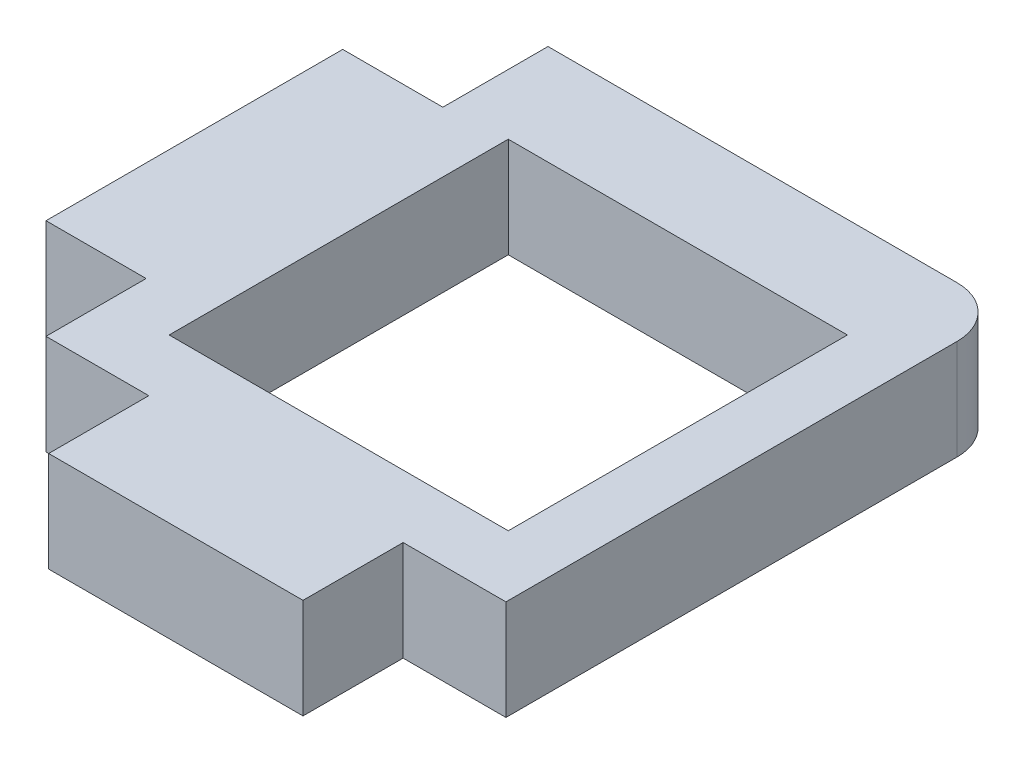
ISO-10303-21;
HEADER;
FILE_DESCRIPTION(('STEP AP214'),'2;1');
FILE_NAME('part.step','',(''),(''),'','','');
FILE_SCHEMA(('AUTOMOTIVE_DESIGN { 1 0 10303 214 1 1 1 1 }'));
ENDSEC;
DATA;
#1=APPLICATION_CONTEXT('core data for automotive mechanical design processes');
#2=APPLICATION_PROTOCOL_DEFINITION('international standard','automotive_design',2000,#1);
#3=PRODUCT_CONTEXT('',#1,'mechanical');
#4=PRODUCT('Part','Part','',(#3));
#5=PRODUCT_RELATED_PRODUCT_CATEGORY('part','',(#4));
#6=PRODUCT_DEFINITION_FORMATION('','',#4);
#7=PRODUCT_DEFINITION_CONTEXT('part definition',#1,'design');
#8=PRODUCT_DEFINITION('design','',#6,#7);
#9=PRODUCT_DEFINITION_SHAPE('','',#8);
#10=(LENGTH_UNIT() NAMED_UNIT(*) SI_UNIT(.MILLI.,.METRE.));
#11=(NAMED_UNIT(*) PLANE_ANGLE_UNIT() SI_UNIT($,.RADIAN.));
#12=(NAMED_UNIT(*) SI_UNIT($,.STERADIAN.) SOLID_ANGLE_UNIT());
#13=UNCERTAINTY_MEASURE_WITH_UNIT(LENGTH_MEASURE(1.E-05),#10,'distance_accuracy_value','');
#14=(GEOMETRIC_REPRESENTATION_CONTEXT(3) GLOBAL_UNCERTAINTY_ASSIGNED_CONTEXT((#13)) GLOBAL_UNIT_ASSIGNED_CONTEXT((#10,
#11,#12)) REPRESENTATION_CONTEXT('',''));
#15=CARTESIAN_POINT('',(0.,0.,0.));
#16=DIRECTION('',(0.,0.,1.));
#17=DIRECTION('',(1.,0.,0.));
#18=AXIS2_PLACEMENT_3D('',#15,#16,#17);
#19=CARTESIAN_POINT('',(6.88974999999999,-3.,0.));
#20=DIRECTION('',(1.,0.,0.));
#21=DIRECTION('',(0.,0.,-1.));
#22=AXIS2_PLACEMENT_3D('',#19,#20,#21);
#23=PLANE('',#22);
#24=DIRECTION('',(0.,0.,-1.));
#25=VECTOR('',#24,1.);
#26=CARTESIAN_POINT('',(6.88974999999999,0.,0.));
#27=LINE('',#26,#25);
#28=CARTESIAN_POINT('',(6.88975,0.,6.0198));
#29=VERTEX_POINT('',#28);
#30=CARTESIAN_POINT('',(6.88975,0.,-7.49579999999999));
#31=VERTEX_POINT('',#30);
#32=EDGE_CURVE('E218',#29,#31,#27,.T.);
#33=ORIENTED_EDGE('',*,*,#32,.F.);
#34=DIRECTION('',(0.,1.,0.));
#35=VECTOR('',#34,1.);
#36=CARTESIAN_POINT('',(6.88975,-3.,6.0198));
#37=LINE('',#36,#35);
#38=CARTESIAN_POINT('',(6.88975,-3.,6.0198));
#39=VERTEX_POINT('',#38);
#40=EDGE_CURVE('E11',#39,#29,#37,.T.);
#41=ORIENTED_EDGE('',*,*,#40,.F.);
#42=DIRECTION('',(0.,0.,-1.));
#43=VECTOR('',#42,1.);
#44=CARTESIAN_POINT('',(6.88974999999999,-3.,0.));
#45=LINE('',#44,#43);
#46=CARTESIAN_POINT('',(6.88975,-3.,-7.49579999999999));
#47=VERTEX_POINT('',#46);
#48=EDGE_CURVE('E328',#39,#47,#45,.T.);
#49=ORIENTED_EDGE('',*,*,#48,.T.);
#50=DIRECTION('',(0.,1.,0.));
#51=VECTOR('',#50,1.);
#52=CARTESIAN_POINT('',(6.88975,-3.,-7.49579999999999));
#53=LINE('',#52,#51);
#54=EDGE_CURVE('E298',#47,#31,#53,.T.);
#55=ORIENTED_EDGE('',*,*,#54,.T.);
#56=EDGE_LOOP('',(#33,#41,#49,#55));
#57=FACE_BOUND('',#56,.T.);
#58=ADVANCED_FACE('F45',(#57),#23,.T.);
#59=CARTESIAN_POINT('',(0.,-3.,6.01980000000001));
#60=DIRECTION('',(0.,0.,1.));
#61=DIRECTION('',(1.,0.,0.));
#62=AXIS2_PLACEMENT_3D('',#59,#60,#61);
#63=PLANE('',#62);
#64=DIRECTION('',(1.,0.,0.));
#65=VECTOR('',#64,1.);
#66=CARTESIAN_POINT('',(0.,0.,6.01980000000001));
#67=LINE('',#66,#65);
#68=CARTESIAN_POINT('',(3.81,0.,6.0198));
#69=VERTEX_POINT('',#68);
#70=EDGE_CURVE('E263',#69,#29,#67,.T.);
#71=ORIENTED_EDGE('',*,*,#70,.F.);
#72=DIRECTION('',(0.,1.,0.));
#73=VECTOR('',#72,1.);
#74=CARTESIAN_POINT('',(3.81,-3.,6.0198));
#75=LINE('',#74,#73);
#76=CARTESIAN_POINT('',(3.81,-3.,6.0198));
#77=VERTEX_POINT('',#76);
#78=EDGE_CURVE('E56',#77,#69,#75,.T.);
#79=ORIENTED_EDGE('',*,*,#78,.F.);
#80=DIRECTION('',(1.,0.,0.));
#81=VECTOR('',#80,1.);
#82=CARTESIAN_POINT('',(0.,-3.,6.01980000000001));
#83=LINE('',#82,#81);
#84=EDGE_CURVE('E188',#77,#39,#83,.T.);
#85=ORIENTED_EDGE('',*,*,#84,.T.);
#86=ORIENTED_EDGE('',*,*,#40,.T.);
#87=EDGE_LOOP('',(#71,#79,#85,#86));
#88=FACE_BOUND('',#87,.T.);
#89=ADVANCED_FACE('F396',(#88),#63,.T.);
#90=CARTESIAN_POINT('',(3.81,-3.,0.));
#91=DIRECTION('',(1.,0.,0.));
#92=DIRECTION('',(0.,0.,-1.));
#93=AXIS2_PLACEMENT_3D('',#90,#91,#92);
#94=PLANE('',#93);
#95=DIRECTION('',(0.,0.,-1.));
#96=VECTOR('',#95,1.);
#97=CARTESIAN_POINT('',(3.81,0.,0.));
#98=LINE('',#97,#96);
#99=CARTESIAN_POINT('',(3.81,0.,9.0198));
#100=VERTEX_POINT('',#99);
#101=EDGE_CURVE('E176',#100,#69,#98,.T.);
#102=ORIENTED_EDGE('',*,*,#101,.F.);
#103=DIRECTION('',(0.,1.,0.));
#104=VECTOR('',#103,1.);
#105=CARTESIAN_POINT('',(3.81,-3.,9.0198));
#106=LINE('',#105,#104);
#107=CARTESIAN_POINT('',(3.81,-3.,9.0198));
#108=VERTEX_POINT('',#107);
#109=EDGE_CURVE('E171',#108,#100,#106,.T.);
#110=ORIENTED_EDGE('',*,*,#109,.F.);
#111=DIRECTION('',(0.,0.,-1.));
#112=VECTOR('',#111,1.);
#113=CARTESIAN_POINT('',(3.81,-3.,0.));
#114=LINE('',#113,#112);
#115=EDGE_CURVE('E174',#108,#77,#114,.T.);
#116=ORIENTED_EDGE('',*,*,#115,.T.);
#117=ORIENTED_EDGE('',*,*,#78,.T.);
#118=EDGE_LOOP('',(#102,#110,#116,#117));
#119=FACE_BOUND('',#118,.T.);
#120=ADVANCED_FACE('F173',(#119),#94,.T.);
#121=CARTESIAN_POINT('',(0.,-3.,9.0198));
#122=DIRECTION('',(0.,0.,1.));
#123=DIRECTION('',(1.,0.,0.));
#124=AXIS2_PLACEMENT_3D('',#121,#122,#123);
#125=PLANE('',#124);
#126=DIRECTION('',(1.,0.,0.));
#127=VECTOR('',#126,1.);
#128=CARTESIAN_POINT('',(0.,0.,9.0198));
#129=LINE('',#128,#127);
#130=CARTESIAN_POINT('',(-3.81,0.,9.0198));
#131=VERTEX_POINT('',#130);
#132=EDGE_CURVE('E258',#131,#100,#129,.T.);
#133=ORIENTED_EDGE('',*,*,#132,.F.);
#134=DIRECTION('',(0.,1.,0.));
#135=VECTOR('',#134,1.);
#136=CARTESIAN_POINT('',(-3.81,-3.,9.0198));
#137=LINE('',#136,#135);
#138=CARTESIAN_POINT('',(-3.81,-3.,9.0198));
#139=VERTEX_POINT('',#138);
#140=EDGE_CURVE('E182',#139,#131,#137,.T.);
#141=ORIENTED_EDGE('',*,*,#140,.F.);
#142=DIRECTION('',(1.,0.,0.));
#143=VECTOR('',#142,1.);
#144=CARTESIAN_POINT('',(0.,-3.,9.0198));
#145=LINE('',#144,#143);
#146=EDGE_CURVE('E187',#139,#108,#145,.T.);
#147=ORIENTED_EDGE('',*,*,#146,.T.);
#148=ORIENTED_EDGE('',*,*,#109,.T.);
#149=EDGE_LOOP('',(#133,#141,#147,#148));
#150=FACE_BOUND('',#149,.T.);
#151=ADVANCED_FACE('F191',(#150),#125,.T.);
#152=CARTESIAN_POINT('',(-3.81,-3.,0.));
#153=DIRECTION('',(1.,0.,0.));
#154=DIRECTION('',(0.,0.,-1.));
#155=AXIS2_PLACEMENT_3D('',#152,#153,#154);
#156=PLANE('',#155);
#157=DIRECTION('',(0.,0.,-1.));
#158=VECTOR('',#157,1.);
#159=CARTESIAN_POINT('',(-3.81,0.,0.));
#160=LINE('',#159,#158);
#161=CARTESIAN_POINT('',(-3.81,0.,6.0198));
#162=VERTEX_POINT('',#161);
#163=EDGE_CURVE('E254',#131,#162,#160,.T.);
#164=ORIENTED_EDGE('',*,*,#163,.T.);
#165=DIRECTION('',(0.,1.,0.));
#166=VECTOR('',#165,1.);
#167=CARTESIAN_POINT('',(-3.81,-3.,6.0198));
#168=LINE('',#167,#166);
#169=CARTESIAN_POINT('',(-3.81,-3.,6.0198));
#170=VERTEX_POINT('',#169);
#171=EDGE_CURVE('E272',#170,#162,#168,.T.);
#172=ORIENTED_EDGE('',*,*,#171,.F.);
#173=DIRECTION('',(0.,0.,-1.));
#174=VECTOR('',#173,1.);
#175=CARTESIAN_POINT('',(-3.81,-3.,0.));
#176=LINE('',#175,#174);
#177=EDGE_CURVE('E194',#139,#170,#176,.T.);
#178=ORIENTED_EDGE('',*,*,#177,.F.);
#179=ORIENTED_EDGE('',*,*,#140,.T.);
#180=EDGE_LOOP('',(#164,#172,#178,#179));
#181=FACE_BOUND('',#180,.T.);
#182=ADVANCED_FACE('F399',(#181),#156,.F.);
#183=CARTESIAN_POINT('',(0.,-3.,6.01980000000001));
#184=DIRECTION('',(0.,0.,1.));
#185=DIRECTION('',(1.,0.,0.));
#186=AXIS2_PLACEMENT_3D('',#183,#184,#185);
#187=PLANE('',#186);
#188=DIRECTION('',(1.,0.,0.));
#189=VECTOR('',#188,1.);
#190=CARTESIAN_POINT('',(0.,0.,6.01980000000001));
#191=LINE('',#190,#189);
#192=CARTESIAN_POINT('',(-6.88975,0.,6.0198));
#193=VERTEX_POINT('',#192);
#194=EDGE_CURVE('E250',#193,#162,#191,.T.);
#195=ORIENTED_EDGE('',*,*,#194,.F.);
#196=DIRECTION('',(0.,1.,0.));
#197=VECTOR('',#196,1.);
#198=CARTESIAN_POINT('',(-6.88975,-3.,6.0198));
#199=LINE('',#198,#197);
#200=CARTESIAN_POINT('',(-6.88975,-3.,6.0198));
#201=VERTEX_POINT('',#200);
#202=EDGE_CURVE('E275',#201,#193,#199,.T.);
#203=ORIENTED_EDGE('',*,*,#202,.F.);
#204=DIRECTION('',(1.,0.,0.));
#205=VECTOR('',#204,1.);
#206=CARTESIAN_POINT('',(0.,-3.,6.01980000000001));
#207=LINE('',#206,#205);
#208=EDGE_CURVE('E197',#201,#170,#207,.T.);
#209=ORIENTED_EDGE('',*,*,#208,.T.);
#210=ORIENTED_EDGE('',*,*,#171,.T.);
#211=EDGE_LOOP('',(#195,#203,#209,#210));
#212=FACE_BOUND('',#211,.T.);
#213=ADVANCED_FACE('F368',(#212),#187,.T.);
#214=CARTESIAN_POINT('',(-6.88975,-3.,0.));
#215=DIRECTION('',(-1.,0.,0.));
#216=DIRECTION('',(0.,0.,1.));
#217=AXIS2_PLACEMENT_3D('',#214,#215,#216);
#218=PLANE('',#217);
#219=DIRECTION('',(0.,0.,1.));
#220=VECTOR('',#219,1.);
#221=CARTESIAN_POINT('',(-6.88975,0.,0.));
#222=LINE('',#221,#220);
#223=CARTESIAN_POINT('',(-6.88975,0.,3.0198));
#224=VERTEX_POINT('',#223);
#225=EDGE_CURVE('E246',#224,#193,#222,.T.);
#226=ORIENTED_EDGE('',*,*,#225,.F.);
#227=DIRECTION('',(0.,1.,0.));
#228=VECTOR('',#227,1.);
#229=CARTESIAN_POINT('',(-6.88975,-3.,3.0198));
#230=LINE('',#229,#228);
#231=CARTESIAN_POINT('',(-6.88975,-3.,3.0198));
#232=VERTEX_POINT('',#231);
#233=EDGE_CURVE('E278',#232,#224,#230,.T.);
#234=ORIENTED_EDGE('',*,*,#233,.F.);
#235=DIRECTION('',(0.,0.,1.));
#236=VECTOR('',#235,1.);
#237=CARTESIAN_POINT('',(-6.88975,-3.,0.));
#238=LINE('',#237,#236);
#239=EDGE_CURVE('E360',#232,#201,#238,.T.);
#240=ORIENTED_EDGE('',*,*,#239,.T.);
#241=ORIENTED_EDGE('',*,*,#202,.T.);
#242=EDGE_LOOP('',(#226,#234,#240,#241));
#243=FACE_BOUND('',#242,.T.);
#244=ADVANCED_FACE('F374',(#243),#218,.T.);
#245=CARTESIAN_POINT('',(0.,-3.,3.0198));
#246=DIRECTION('',(0.,0.,1.));
#247=DIRECTION('',(1.,0.,0.));
#248=AXIS2_PLACEMENT_3D('',#245,#246,#247);
#249=PLANE('',#248);
#250=DIRECTION('',(1.,0.,0.));
#251=VECTOR('',#250,1.);
#252=CARTESIAN_POINT('',(0.,0.,3.0198));
#253=LINE('',#252,#251);
#254=CARTESIAN_POINT('',(-9.88975,0.,3.0198));
#255=VERTEX_POINT('',#254);
#256=EDGE_CURVE('E242',#255,#224,#253,.T.);
#257=ORIENTED_EDGE('',*,*,#256,.F.);
#258=DIRECTION('',(0.,1.,0.));
#259=VECTOR('',#258,1.);
#260=CARTESIAN_POINT('',(-9.88975,-3.,3.0198));
#261=LINE('',#260,#259);
#262=CARTESIAN_POINT('',(-9.88975,-3.,3.0198));
#263=VERTEX_POINT('',#262);
#264=EDGE_CURVE('E281',#263,#255,#261,.T.);
#265=ORIENTED_EDGE('',*,*,#264,.F.);
#266=DIRECTION('',(1.,0.,0.));
#267=VECTOR('',#266,1.);
#268=CARTESIAN_POINT('',(0.,-3.,3.0198));
#269=LINE('',#268,#267);
#270=EDGE_CURVE('E356',#263,#232,#269,.T.);
#271=ORIENTED_EDGE('',*,*,#270,.T.);
#272=ORIENTED_EDGE('',*,*,#233,.T.);
#273=EDGE_LOOP('',(#257,#265,#271,#272));
#274=FACE_BOUND('',#273,.T.);
#275=ADVANCED_FACE('F377',(#274),#249,.T.);
#276=CARTESIAN_POINT('',(-9.88975,-3.,0.));
#277=DIRECTION('',(1.,0.,0.));
#278=DIRECTION('',(0.,0.,-1.));
#279=AXIS2_PLACEMENT_3D('',#276,#277,#278);
#280=PLANE('',#279);
#281=DIRECTION('',(0.,0.,-1.));
#282=VECTOR('',#281,1.);
#283=CARTESIAN_POINT('',(-9.88975,0.,0.));
#284=LINE('',#283,#282);
#285=CARTESIAN_POINT('',(-9.88975,0.,-5.8702));
#286=VERTEX_POINT('',#285);
#287=EDGE_CURVE('E238',#255,#286,#284,.T.);
#288=ORIENTED_EDGE('',*,*,#287,.T.);
#289=DIRECTION('',(0.,1.,0.));
#290=VECTOR('',#289,1.);
#291=CARTESIAN_POINT('',(-9.88975,-3.,-5.8702));
#292=LINE('',#291,#290);
#293=CARTESIAN_POINT('',(-9.88975,-3.,-5.8702));
#294=VERTEX_POINT('',#293);
#295=EDGE_CURVE('E284',#294,#286,#292,.T.);
#296=ORIENTED_EDGE('',*,*,#295,.F.);
#297=DIRECTION('',(0.,0.,-1.));
#298=VECTOR('',#297,1.);
#299=CARTESIAN_POINT('',(-9.88975,-3.,0.));
#300=LINE('',#299,#298);
#301=EDGE_CURVE('E352',#263,#294,#300,.T.);
#302=ORIENTED_EDGE('',*,*,#301,.F.);
#303=ORIENTED_EDGE('',*,*,#264,.T.);
#304=EDGE_LOOP('',(#288,#296,#302,#303));
#305=FACE_BOUND('',#304,.T.);
#306=ADVANCED_FACE('F382',(#305),#280,.F.);
#307=CARTESIAN_POINT('',(0.,-3.,-5.87019999999999));
#308=DIRECTION('',(0.,0.,1.));
#309=DIRECTION('',(1.,0.,0.));
#310=AXIS2_PLACEMENT_3D('',#307,#308,#309);
#311=PLANE('',#310);
#312=DIRECTION('',(1.,0.,0.));
#313=VECTOR('',#312,1.);
#314=CARTESIAN_POINT('',(0.,0.,-5.87019999999999));
#315=LINE('',#314,#313);
#316=CARTESIAN_POINT('',(-6.88975,0.,-5.87019999999999));
#317=VERTEX_POINT('',#316);
#318=EDGE_CURVE('E234',#286,#317,#315,.T.);
#319=ORIENTED_EDGE('',*,*,#318,.T.);
#320=DIRECTION('',(0.,1.,0.));
#321=VECTOR('',#320,1.);
#322=CARTESIAN_POINT('',(-6.88975,-3.,-5.87019999999999));
#323=LINE('',#322,#321);
#324=CARTESIAN_POINT('',(-6.88975,-3.,-5.87019999999999));
#325=VERTEX_POINT('',#324);
#326=EDGE_CURVE('E288',#325,#317,#323,.T.);
#327=ORIENTED_EDGE('',*,*,#326,.F.);
#328=DIRECTION('',(1.,0.,0.));
#329=VECTOR('',#328,1.);
#330=CARTESIAN_POINT('',(0.,-3.,-5.87019999999999));
#331=LINE('',#330,#329);
#332=EDGE_CURVE('E348',#294,#325,#331,.T.);
#333=ORIENTED_EDGE('',*,*,#332,.F.);
#334=ORIENTED_EDGE('',*,*,#295,.T.);
#335=EDGE_LOOP('',(#319,#327,#333,#334));
#336=FACE_BOUND('',#335,.T.);
#337=ADVANCED_FACE('F385',(#336),#311,.F.);
#338=CARTESIAN_POINT('',(-6.88975,-3.,0.));
#339=DIRECTION('',(1.,0.,0.));
#340=DIRECTION('',(0.,0.,-1.));
#341=AXIS2_PLACEMENT_3D('',#338,#339,#340);
#342=PLANE('',#341);
#343=DIRECTION('',(0.,0.,-1.));
#344=VECTOR('',#343,1.);
#345=CARTESIAN_POINT('',(-6.88975,0.,0.));
#346=LINE('',#345,#344);
#347=CARTESIAN_POINT('',(-6.88975,0.,-9.0198));
#348=VERTEX_POINT('',#347);
#349=EDGE_CURVE('E230',#317,#348,#346,.T.);
#350=ORIENTED_EDGE('',*,*,#349,.T.);
#351=DIRECTION('',(0.,1.,0.));
#352=VECTOR('',#351,1.);
#353=CARTESIAN_POINT('',(-6.88975,-3.,-9.0198));
#354=LINE('',#353,#352);
#355=CARTESIAN_POINT('',(-6.88975,-3.,-9.0198));
#356=VERTEX_POINT('',#355);
#357=EDGE_CURVE('E292',#356,#348,#354,.T.);
#358=ORIENTED_EDGE('',*,*,#357,.F.);
#359=DIRECTION('',(0.,0.,-1.));
#360=VECTOR('',#359,1.);
#361=CARTESIAN_POINT('',(-6.88975,-3.,0.));
#362=LINE('',#361,#360);
#363=EDGE_CURVE('E345',#325,#356,#362,.T.);
#364=ORIENTED_EDGE('',*,*,#363,.F.);
#365=ORIENTED_EDGE('',*,*,#326,.T.);
#366=EDGE_LOOP('',(#350,#358,#364,#365));
#367=FACE_BOUND('',#366,.T.);
#368=ADVANCED_FACE('F387',(#367),#342,.F.);
#369=CARTESIAN_POINT('',(0.,-3.,-9.0198));
#370=DIRECTION('',(0.,0.,-1.));
#371=DIRECTION('',(-1.,0.,0.));
#372=AXIS2_PLACEMENT_3D('',#369,#370,#371);
#373=PLANE('',#372);
#374=DIRECTION('',(-1.,0.,0.));
#375=VECTOR('',#374,1.);
#376=CARTESIAN_POINT('',(0.,0.,-9.0198));
#377=LINE('',#376,#375);
#378=CARTESIAN_POINT('',(5.36574999999999,0.,-9.0198));
#379=VERTEX_POINT('',#378);
#380=EDGE_CURVE('E226',#379,#348,#377,.T.);
#381=ORIENTED_EDGE('',*,*,#380,.F.);
#382=DIRECTION('',(0.,1.,0.));
#383=VECTOR('',#382,1.);
#384=CARTESIAN_POINT('',(5.36574999999999,-3.,-9.0198));
#385=LINE('',#384,#383);
#386=CARTESIAN_POINT('',(5.36574999999999,-3.,-9.0198));
#387=VERTEX_POINT('',#386);
#388=EDGE_CURVE('E295',#387,#379,#385,.T.);
#389=ORIENTED_EDGE('',*,*,#388,.F.);
#390=DIRECTION('',(-1.,0.,0.));
#391=VECTOR('',#390,1.);
#392=CARTESIAN_POINT('',(0.,-3.,-9.0198));
#393=LINE('',#392,#391);
#394=EDGE_CURVE('E341',#387,#356,#393,.T.);
#395=ORIENTED_EDGE('',*,*,#394,.T.);
#396=ORIENTED_EDGE('',*,*,#357,.T.);
#397=EDGE_LOOP('',(#381,#389,#395,#396));
#398=FACE_BOUND('',#397,.T.);
#399=ADVANCED_FACE('F496',(#398),#373,.T.);
#400=CARTESIAN_POINT('',(5.08,-3.,0.));
#401=DIRECTION('',(1.,0.,0.));
#402=DIRECTION('',(0.,0.,-1.));
#403=AXIS2_PLACEMENT_3D('',#400,#401,#402);
#404=PLANE('',#403);
#405=DIRECTION('',(0.,0.,-1.));
#406=VECTOR('',#405,1.);
#407=CARTESIAN_POINT('',(5.08,0.,0.));
#408=LINE('',#407,#406);
#409=CARTESIAN_POINT('',(5.08,0.,4.1402));
#410=VERTEX_POINT('',#409);
#411=CARTESIAN_POINT('',(5.08,0.,-6.0198));
#412=VERTEX_POINT('',#411);
#413=EDGE_CURVE('E203',#410,#412,#408,.T.);
#414=ORIENTED_EDGE('',*,*,#413,.T.);
#415=DIRECTION('',(0.,1.,0.));
#416=VECTOR('',#415,1.);
#417=CARTESIAN_POINT('',(5.08,-3.,-6.0198));
#418=LINE('',#417,#416);
#419=CARTESIAN_POINT('',(5.08,-3.,-6.0198));
#420=VERTEX_POINT('',#419);
#421=EDGE_CURVE('E301',#420,#412,#418,.T.);
#422=ORIENTED_EDGE('',*,*,#421,.F.);
#423=DIRECTION('',(0.,0.,-1.));
#424=VECTOR('',#423,1.);
#425=CARTESIAN_POINT('',(5.08,-3.,0.));
#426=LINE('',#425,#424);
#427=CARTESIAN_POINT('',(5.08,-3.,4.1402));
#428=VERTEX_POINT('',#427);
#429=EDGE_CURVE('E266',#428,#420,#426,.T.);
#430=ORIENTED_EDGE('',*,*,#429,.F.);
#431=DIRECTION('',(0.,1.,0.));
#432=VECTOR('',#431,1.);
#433=CARTESIAN_POINT('',(5.08,-3.,4.1402));
#434=LINE('',#433,#432);
#435=EDGE_CURVE('E49',#428,#410,#434,.T.);
#436=ORIENTED_EDGE('',*,*,#435,.T.);
#437=EDGE_LOOP('',(#414,#422,#430,#436));
#438=FACE_BOUND('',#437,.T.);
#439=ADVANCED_FACE('F47',(#438),#404,.F.);
#440=CARTESIAN_POINT('',(0.,-3.,-6.0198));
#441=DIRECTION('',(0.,0.,1.));
#442=DIRECTION('',(1.,0.,0.));
#443=AXIS2_PLACEMENT_3D('',#440,#441,#442);
#444=PLANE('',#443);
#445=DIRECTION('',(1.,0.,0.));
#446=VECTOR('',#445,1.);
#447=CARTESIAN_POINT('',(0.,0.,-6.0198));
#448=LINE('',#447,#446);
#449=CARTESIAN_POINT('',(-5.08,0.,-6.0198));
#450=VERTEX_POINT('',#449);
#451=EDGE_CURVE('E214',#450,#412,#448,.T.);
#452=ORIENTED_EDGE('',*,*,#451,.F.);
#453=DIRECTION('',(0.,1.,0.));
#454=VECTOR('',#453,1.);
#455=CARTESIAN_POINT('',(-5.08,-3.,-6.0198));
#456=LINE('',#455,#454);
#457=CARTESIAN_POINT('',(-5.08,-3.,-6.0198));
#458=VERTEX_POINT('',#457);
#459=EDGE_CURVE('E304',#458,#450,#456,.T.);
#460=ORIENTED_EDGE('',*,*,#459,.F.);
#461=DIRECTION('',(1.,0.,0.));
#462=VECTOR('',#461,1.);
#463=CARTESIAN_POINT('',(0.,-3.,-6.0198));
#464=LINE('',#463,#462);
#465=EDGE_CURVE('E326',#458,#420,#464,.T.);
#466=ORIENTED_EDGE('',*,*,#465,.T.);
#467=ORIENTED_EDGE('',*,*,#421,.T.);
#468=EDGE_LOOP('',(#452,#460,#466,#467));
#469=FACE_BOUND('',#468,.T.);
#470=ADVANCED_FACE('F322',(#469),#444,.T.);
#471=CARTESIAN_POINT('',(-5.08,-3.,0.));
#472=DIRECTION('',(1.,0.,0.));
#473=DIRECTION('',(0.,0.,-1.));
#474=AXIS2_PLACEMENT_3D('',#471,#472,#473);
#475=PLANE('',#474);
#476=DIRECTION('',(0.,0.,-1.));
#477=VECTOR('',#476,1.);
#478=CARTESIAN_POINT('',(-5.08,0.,0.));
#479=LINE('',#478,#477);
#480=CARTESIAN_POINT('',(-5.08,0.,4.1402));
#481=VERTEX_POINT('',#480);
#482=EDGE_CURVE('E210',#481,#450,#479,.T.);
#483=ORIENTED_EDGE('',*,*,#482,.F.);
#484=DIRECTION('',(0.,1.,0.));
#485=VECTOR('',#484,1.);
#486=CARTESIAN_POINT('',(-5.08,-3.,4.1402));
#487=LINE('',#486,#485);
#488=CARTESIAN_POINT('',(-5.08,-3.,4.1402));
#489=VERTEX_POINT('',#488);
#490=EDGE_CURVE('E306',#489,#481,#487,.T.);
#491=ORIENTED_EDGE('',*,*,#490,.F.);
#492=DIRECTION('',(0.,0.,-1.));
#493=VECTOR('',#492,1.);
#494=CARTESIAN_POINT('',(-5.08,-3.,0.));
#495=LINE('',#494,#493);
#496=EDGE_CURVE('E329',#489,#458,#495,.T.);
#497=ORIENTED_EDGE('',*,*,#496,.T.);
#498=ORIENTED_EDGE('',*,*,#459,.T.);
#499=EDGE_LOOP('',(#483,#491,#497,#498));
#500=FACE_BOUND('',#499,.T.);
#501=ADVANCED_FACE('F419',(#500),#475,.T.);
#502=CARTESIAN_POINT('',(0.,-3.,4.1402));
#503=DIRECTION('',(0.,0.,1.));
#504=DIRECTION('',(1.,0.,0.));
#505=AXIS2_PLACEMENT_3D('',#502,#503,#504);
#506=PLANE('',#505);
#507=DIRECTION('',(1.,0.,0.));
#508=VECTOR('',#507,1.);
#509=CARTESIAN_POINT('',(0.,0.,4.1402));
#510=LINE('',#509,#508);
#511=EDGE_CURVE('E207',#481,#410,#510,.T.);
#512=ORIENTED_EDGE('',*,*,#511,.T.);
#513=ORIENTED_EDGE('',*,*,#435,.F.);
#514=DIRECTION('',(1.,0.,0.));
#515=VECTOR('',#514,1.);
#516=CARTESIAN_POINT('',(0.,-3.,4.1402));
#517=LINE('',#516,#515);
#518=EDGE_CURVE('E131',#489,#428,#517,.T.);
#519=ORIENTED_EDGE('',*,*,#518,.F.);
#520=ORIENTED_EDGE('',*,*,#490,.T.);
#521=EDGE_LOOP('',(#512,#513,#519,#520));
#522=FACE_BOUND('',#521,.T.);
#523=ADVANCED_FACE('F421',(#522),#506,.F.);
#524=CARTESIAN_POINT('',(5.36575,-3.,-7.4958));
#525=DIRECTION('',(0.,1.,0.));
#526=DIRECTION('',(0.,0.,1.));
#527=AXIS2_PLACEMENT_3D('',#524,#525,#526);
#528=CYLINDRICAL_SURFACE('',#527,1.524);
#529=CARTESIAN_POINT('',(5.36575,0.,-7.4958));
#530=DIRECTION('',(0.,1.,0.));
#531=DIRECTION('',(0.,0.,1.));
#532=AXIS2_PLACEMENT_3D('',#529,#530,#531);
#533=CIRCLE('',#532,1.524);
#534=EDGE_CURVE('E222',#31,#379,#533,.T.);
#535=ORIENTED_EDGE('',*,*,#534,.F.);
#536=ORIENTED_EDGE('',*,*,#54,.F.);
#537=CARTESIAN_POINT('',(5.36575,-3.,-7.4958));
#538=DIRECTION('',(0.,1.,0.));
#539=DIRECTION('',(0.,0.,1.));
#540=AXIS2_PLACEMENT_3D('',#537,#538,#539);
#541=CIRCLE('',#540,1.524);
#542=EDGE_CURVE('E333',#47,#387,#541,.T.);
#543=ORIENTED_EDGE('',*,*,#542,.T.);
#544=ORIENTED_EDGE('',*,*,#388,.T.);
#545=EDGE_LOOP('',(#535,#536,#543,#544));
#546=FACE_BOUND('',#545,.T.);
#547=ADVANCED_FACE('F394',(#546),#528,.T.);
#548=CARTESIAN_POINT('',(0.,-3.,0.));
#549=DIRECTION('',(0.,1.,0.));
#550=DIRECTION('',(0.,0.,1.));
#551=AXIS2_PLACEMENT_3D('',#548,#549,#550);
#552=PLANE('',#551);
#553=ORIENTED_EDGE('',*,*,#429,.T.);
#554=ORIENTED_EDGE('',*,*,#465,.F.);
#555=ORIENTED_EDGE('',*,*,#496,.F.);
#556=ORIENTED_EDGE('',*,*,#518,.T.);
#557=EDGE_LOOP('',(#553,#554,#555,#556));
#558=FACE_BOUND('',#557,.T.);
#559=ORIENTED_EDGE('',*,*,#48,.F.);
#560=ORIENTED_EDGE('',*,*,#84,.F.);
#561=ORIENTED_EDGE('',*,*,#115,.F.);
#562=ORIENTED_EDGE('',*,*,#146,.F.);
#563=ORIENTED_EDGE('',*,*,#177,.T.);
#564=ORIENTED_EDGE('',*,*,#208,.F.);
#565=ORIENTED_EDGE('',*,*,#239,.F.);
#566=ORIENTED_EDGE('',*,*,#270,.F.);
#567=ORIENTED_EDGE('',*,*,#301,.T.);
#568=ORIENTED_EDGE('',*,*,#332,.T.);
#569=ORIENTED_EDGE('',*,*,#363,.T.);
#570=ORIENTED_EDGE('',*,*,#394,.F.);
#571=ORIENTED_EDGE('',*,*,#542,.F.);
#572=EDGE_LOOP('',(#559,#560,#561,#562,#563,#564,#565,#566,#567,#568,#569,#570,#571));
#573=FACE_BOUND('',#572,.T.);
#574=ADVANCED_FACE('F186',(#558,#573),#552,.F.);
#575=CARTESIAN_POINT('',(0.,0.,0.));
#576=DIRECTION('',(0.,1.,0.));
#577=DIRECTION('',(0.,0.,1.));
#578=AXIS2_PLACEMENT_3D('',#575,#576,#577);
#579=PLANE('',#578);
#580=ORIENTED_EDGE('',*,*,#413,.F.);
#581=ORIENTED_EDGE('',*,*,#511,.F.);
#582=ORIENTED_EDGE('',*,*,#482,.T.);
#583=ORIENTED_EDGE('',*,*,#451,.T.);
#584=EDGE_LOOP('',(#580,#581,#582,#583));
#585=FACE_BOUND('',#584,.T.);
#586=ORIENTED_EDGE('',*,*,#32,.T.);
#587=ORIENTED_EDGE('',*,*,#534,.T.);
#588=ORIENTED_EDGE('',*,*,#380,.T.);
#589=ORIENTED_EDGE('',*,*,#349,.F.);
#590=ORIENTED_EDGE('',*,*,#318,.F.);
#591=ORIENTED_EDGE('',*,*,#287,.F.);
#592=ORIENTED_EDGE('',*,*,#256,.T.);
#593=ORIENTED_EDGE('',*,*,#225,.T.);
#594=ORIENTED_EDGE('',*,*,#194,.T.);
#595=ORIENTED_EDGE('',*,*,#163,.F.);
#596=ORIENTED_EDGE('',*,*,#132,.T.);
#597=ORIENTED_EDGE('',*,*,#101,.T.);
#598=ORIENTED_EDGE('',*,*,#70,.T.);
#599=EDGE_LOOP('',(#586,#587,#588,#589,#590,#591,#592,#593,#594,#595,#596,#597,#598));
#600=FACE_BOUND('',#599,.T.);
#601=ADVANCED_FACE('F317',(#585,#600),#579,.T.);
#602=CLOSED_SHELL('',(#58,#89,#120,#151,#182,#213,#244,#275,#306,#337,#368,#399,#439,#470,#501,
#523,#547,#574,#601));
#603=MANIFOLD_SOLID_BREP('B2',#602);
#604=ADVANCED_BREP_SHAPE_REPRESENTATION('',(#18,#603),#14);
#605=SHAPE_DEFINITION_REPRESENTATION(#9,#604);
ENDSEC;
END-ISO-10303-21;
